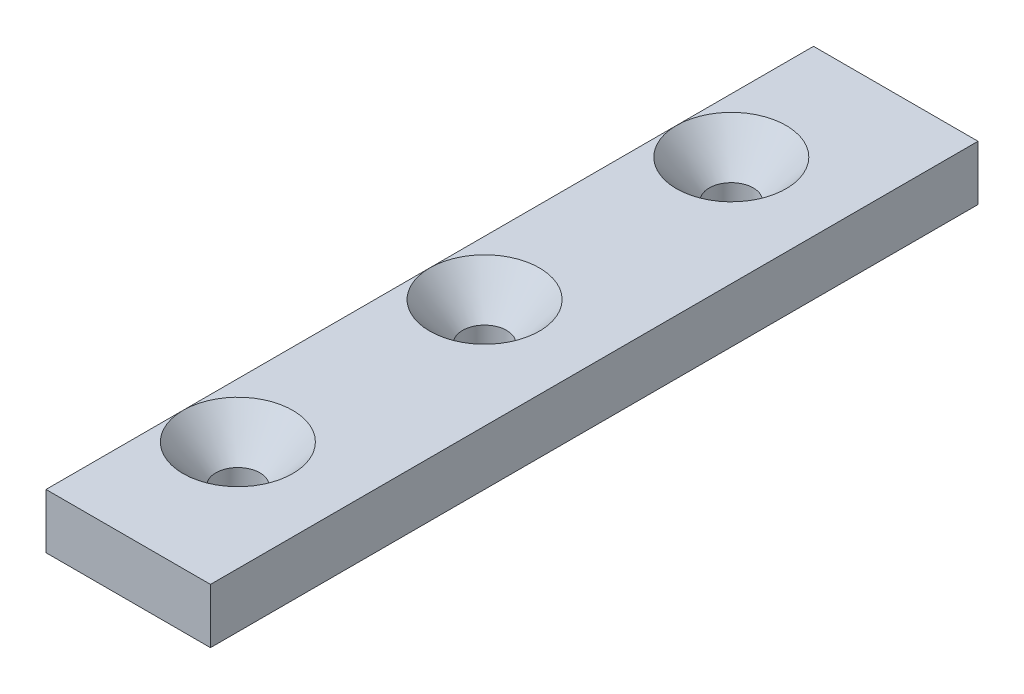
ISO-10303-21;
HEADER;
FILE_DESCRIPTION(('STEP AP214'),'2;1');
FILE_NAME('part.step','',(''),(''),'','','');
FILE_SCHEMA(('AUTOMOTIVE_DESIGN { 1 0 10303 214 1 1 1 1 }'));
ENDSEC;
DATA;
#1=APPLICATION_CONTEXT('core data for automotive mechanical design processes');
#2=APPLICATION_PROTOCOL_DEFINITION('international standard','automotive_design',2000,#1);
#3=PRODUCT_CONTEXT('',#1,'mechanical');
#4=PRODUCT('Part','Part','',(#3));
#5=PRODUCT_RELATED_PRODUCT_CATEGORY('part','',(#4));
#6=PRODUCT_DEFINITION_FORMATION('','',#4);
#7=PRODUCT_DEFINITION_CONTEXT('part definition',#1,'design');
#8=PRODUCT_DEFINITION('design','',#6,#7);
#9=PRODUCT_DEFINITION_SHAPE('','',#8);
#10=(LENGTH_UNIT() NAMED_UNIT(*) SI_UNIT(.MILLI.,.METRE.));
#11=(NAMED_UNIT(*) PLANE_ANGLE_UNIT() SI_UNIT($,.RADIAN.));
#12=(NAMED_UNIT(*) SI_UNIT($,.STERADIAN.) SOLID_ANGLE_UNIT());
#13=UNCERTAINTY_MEASURE_WITH_UNIT(LENGTH_MEASURE(1.E-05),#10,'distance_accuracy_value','');
#14=(GEOMETRIC_REPRESENTATION_CONTEXT(3) GLOBAL_UNCERTAINTY_ASSIGNED_CONTEXT((#13)) GLOBAL_UNIT_ASSIGNED_CONTEXT((#10,
#11,#12)) REPRESENTATION_CONTEXT('',''));
#15=CARTESIAN_POINT('',(0.,0.,0.));
#16=DIRECTION('',(0.,0.,1.));
#17=DIRECTION('',(1.,0.,0.));
#18=AXIS2_PLACEMENT_3D('',#15,#16,#17);
#19=CARTESIAN_POINT('',(0.,6.35,0.));
#20=DIRECTION('',(-1.,0.,0.));
#21=DIRECTION('',(0.,0.,1.));
#22=AXIS2_PLACEMENT_3D('',#19,#20,#21);
#23=PLANE('',#22);
#24=DIRECTION('',(0.,0.,-1.));
#25=VECTOR('',#24,1.);
#26=CARTESIAN_POINT('',(0.,0.,0.));
#27=LINE('',#26,#25);
#28=CARTESIAN_POINT('',(0.,0.,0.));
#29=VERTEX_POINT('',#28);
#30=CARTESIAN_POINT('',(0.,0.,-88.9));
#31=VERTEX_POINT('',#30);
#32=EDGE_CURVE('E106',#29,#31,#27,.T.);
#33=ORIENTED_EDGE('',*,*,#32,.T.);
#34=DIRECTION('',(0.,-1.,0.));
#35=VECTOR('',#34,1.);
#36=CARTESIAN_POINT('',(0.,6.35,-88.9));
#37=LINE('',#36,#35);
#38=CARTESIAN_POINT('',(0.,6.35,-88.9));
#39=VERTEX_POINT('',#38);
#40=EDGE_CURVE('E11',#39,#31,#37,.T.);
#41=ORIENTED_EDGE('',*,*,#40,.F.);
#42=DIRECTION('',(0.,0.,-1.));
#43=VECTOR('',#42,1.);
#44=CARTESIAN_POINT('',(0.,6.35,0.));
#45=LINE('',#44,#43);
#46=CARTESIAN_POINT('',(0.,6.35,0.));
#47=VERTEX_POINT('',#46);
#48=EDGE_CURVE('E93',#47,#39,#45,.T.);
#49=ORIENTED_EDGE('',*,*,#48,.F.);
#50=DIRECTION('',(0.,-1.,0.));
#51=VECTOR('',#50,1.);
#52=CARTESIAN_POINT('',(0.,6.35,0.));
#53=LINE('',#52,#51);
#54=EDGE_CURVE('E107',#47,#29,#53,.T.);
#55=ORIENTED_EDGE('',*,*,#54,.T.);
#56=EDGE_LOOP('',(#33,#41,#49,#55));
#57=FACE_BOUND('',#56,.T.);
#58=ADVANCED_FACE('F37',(#57),#23,.F.);
#59=CARTESIAN_POINT('',(0.,6.35,-88.9));
#60=DIRECTION('',(0.,0.,1.));
#61=DIRECTION('',(1.,0.,0.));
#62=AXIS2_PLACEMENT_3D('',#59,#60,#61);
#63=PLANE('',#62);
#64=DIRECTION('',(-1.,0.,0.));
#65=VECTOR('',#64,1.);
#66=CARTESIAN_POINT('',(0.,0.,-88.9));
#67=LINE('',#66,#65);
#68=CARTESIAN_POINT('',(-19.05,0.,-88.9));
#69=VERTEX_POINT('',#68);
#70=EDGE_CURVE('E110',#31,#69,#67,.T.);
#71=ORIENTED_EDGE('',*,*,#70,.T.);
#72=DIRECTION('',(0.,-1.,0.));
#73=VECTOR('',#72,1.);
#74=CARTESIAN_POINT('',(-19.05,6.35,-88.9));
#75=LINE('',#74,#73);
#76=CARTESIAN_POINT('',(-19.05,6.35,-88.9));
#77=VERTEX_POINT('',#76);
#78=EDGE_CURVE('E44',#77,#69,#75,.T.);
#79=ORIENTED_EDGE('',*,*,#78,.F.);
#80=DIRECTION('',(-1.,0.,0.));
#81=VECTOR('',#80,1.);
#82=CARTESIAN_POINT('',(0.,6.35,-88.9));
#83=LINE('',#82,#81);
#84=EDGE_CURVE('E83',#39,#77,#83,.T.);
#85=ORIENTED_EDGE('',*,*,#84,.F.);
#86=ORIENTED_EDGE('',*,*,#40,.T.);
#87=EDGE_LOOP('',(#71,#79,#85,#86));
#88=FACE_BOUND('',#87,.T.);
#89=ADVANCED_FACE('F85',(#88),#63,.F.);
#90=CARTESIAN_POINT('',(-19.05,6.35,0.));
#91=DIRECTION('',(1.,0.,0.));
#92=DIRECTION('',(0.,0.,-1.));
#93=AXIS2_PLACEMENT_3D('',#90,#91,#92);
#94=PLANE('',#93);
#95=DIRECTION('',(0.,0.,1.));
#96=VECTOR('',#95,1.);
#97=CARTESIAN_POINT('',(-19.05,0.,0.));
#98=LINE('',#97,#96);
#99=CARTESIAN_POINT('',(-19.05,0.,0.));
#100=VERTEX_POINT('',#99);
#101=EDGE_CURVE('E113',#69,#100,#98,.T.);
#102=ORIENTED_EDGE('',*,*,#101,.T.);
#103=DIRECTION('',(0.,-1.,0.));
#104=VECTOR('',#103,1.);
#105=CARTESIAN_POINT('',(-19.05,6.35,0.));
#106=LINE('',#105,#104);
#107=CARTESIAN_POINT('',(-19.05,6.35,0.));
#108=VERTEX_POINT('',#107);
#109=EDGE_CURVE('E124',#108,#100,#106,.T.);
#110=ORIENTED_EDGE('',*,*,#109,.F.);
#111=DIRECTION('',(0.,0.,1.));
#112=VECTOR('',#111,1.);
#113=CARTESIAN_POINT('',(-19.05,6.35,0.));
#114=LINE('',#113,#112);
#115=CARTESIAN_POINT('',(-19.05,6.35,-15.875));
#116=VERTEX_POINT('',#115);
#117=EDGE_CURVE('E92',#116,#108,#114,.T.);
#118=ORIENTED_EDGE('',*,*,#117,.F.);
#119=CARTESIAN_POINT('',(-19.05,6.35,-44.45));
#120=VERTEX_POINT('',#119);
#121=EDGE_CURVE('E137',#120,#116,#114,.T.);
#122=ORIENTED_EDGE('',*,*,#121,.F.);
#123=CARTESIAN_POINT('',(-19.05,6.35,-73.025));
#124=VERTEX_POINT('',#123);
#125=EDGE_CURVE('E139',#124,#120,#114,.T.);
#126=ORIENTED_EDGE('',*,*,#125,.F.);
#127=EDGE_CURVE('E131',#77,#124,#114,.T.);
#128=ORIENTED_EDGE('',*,*,#127,.F.);
#129=ORIENTED_EDGE('',*,*,#78,.T.);
#130=EDGE_LOOP('',(#102,#110,#118,#122,#126,#128,#129));
#131=FACE_BOUND('',#130,.T.);
#132=ADVANCED_FACE('F128',(#131),#94,.F.);
#133=CARTESIAN_POINT('',(0.,6.35,0.));
#134=DIRECTION('',(0.,0.,-1.));
#135=DIRECTION('',(-1.,0.,0.));
#136=AXIS2_PLACEMENT_3D('',#133,#134,#135);
#137=PLANE('',#136);
#138=DIRECTION('',(1.,0.,0.));
#139=VECTOR('',#138,1.);
#140=CARTESIAN_POINT('',(0.,0.,0.));
#141=LINE('',#140,#139);
#142=EDGE_CURVE('E103',#100,#29,#141,.T.);
#143=ORIENTED_EDGE('',*,*,#142,.T.);
#144=ORIENTED_EDGE('',*,*,#54,.F.);
#145=DIRECTION('',(1.,0.,0.));
#146=VECTOR('',#145,1.);
#147=CARTESIAN_POINT('',(0.,6.35,0.));
#148=LINE('',#147,#146);
#149=EDGE_CURVE('E99',#108,#47,#148,.T.);
#150=ORIENTED_EDGE('',*,*,#149,.F.);
#151=ORIENTED_EDGE('',*,*,#109,.T.);
#152=EDGE_LOOP('',(#143,#144,#150,#151));
#153=FACE_BOUND('',#152,.T.);
#154=ADVANCED_FACE('F134',(#153),#137,.F.);
#155=CARTESIAN_POINT('',(0.,6.35,0.));
#156=DIRECTION('',(0.,1.,0.));
#157=DIRECTION('',(0.,0.,1.));
#158=AXIS2_PLACEMENT_3D('',#155,#156,#157);
#159=PLANE('',#158);
#160=ORIENTED_EDGE('',*,*,#121,.T.);
#161=CARTESIAN_POINT('',(-12.7,6.35,-15.875));
#162=DIRECTION('',(0.,1.,0.));
#163=DIRECTION('',(0.,0.,1.));
#164=AXIS2_PLACEMENT_3D('',#161,#162,#163);
#165=CIRCLE('',#164,6.35);
#166=EDGE_CURVE('E49',#116,#116,#165,.T.);
#167=ORIENTED_EDGE('',*,*,#166,.F.);
#168=ORIENTED_EDGE('',*,*,#117,.T.);
#169=ORIENTED_EDGE('',*,*,#149,.T.);
#170=ORIENTED_EDGE('',*,*,#48,.T.);
#171=ORIENTED_EDGE('',*,*,#84,.T.);
#172=ORIENTED_EDGE('',*,*,#127,.T.);
#173=CARTESIAN_POINT('',(-12.7,6.35,-73.025));
#174=DIRECTION('',(0.,1.,0.));
#175=DIRECTION('',(0.,0.,1.));
#176=AXIS2_PLACEMENT_3D('',#173,#174,#175);
#177=CIRCLE('',#176,6.35);
#178=EDGE_CURVE('E143',#124,#124,#177,.T.);
#179=ORIENTED_EDGE('',*,*,#178,.F.);
#180=ORIENTED_EDGE('',*,*,#125,.T.);
#181=CARTESIAN_POINT('',(-12.7,6.35,-44.45));
#182=DIRECTION('',(0.,1.,0.));
#183=DIRECTION('',(0.,0.,1.));
#184=AXIS2_PLACEMENT_3D('',#181,#182,#183);
#185=CIRCLE('',#184,6.35);
#186=EDGE_CURVE('E54',#120,#120,#185,.T.);
#187=ORIENTED_EDGE('',*,*,#186,.F.);
#188=EDGE_LOOP('',(#160,#167,#168,#169,#170,#171,#172,#179,#180,#187));
#189=FACE_BOUND('',#188,.T.);
#190=ADVANCED_FACE('F97',(#189),#159,.T.);
#191=CARTESIAN_POINT('',(0.,0.,0.));
#192=DIRECTION('',(0.,1.,0.));
#193=DIRECTION('',(0.,0.,1.));
#194=AXIS2_PLACEMENT_3D('',#191,#192,#193);
#195=PLANE('',#194);
#196=CARTESIAN_POINT('',(-12.7,0.,-15.875));
#197=DIRECTION('',(0.,1.,0.));
#198=DIRECTION('',(0.,0.,1.));
#199=AXIS2_PLACEMENT_3D('',#196,#197,#198);
#200=CIRCLE('',#199,2.5527);
#201=CARTESIAN_POINT('',(-12.7,0.,-13.3223));
#202=VERTEX_POINT('',#201);
#203=EDGE_CURVE('E152',#202,#202,#200,.T.);
#204=ORIENTED_EDGE('',*,*,#203,.T.);
#205=EDGE_LOOP('',(#204));
#206=FACE_BOUND('',#205,.T.);
#207=CARTESIAN_POINT('',(-12.7,0.,-44.45));
#208=DIRECTION('',(0.,1.,0.));
#209=DIRECTION('',(0.,0.,1.));
#210=AXIS2_PLACEMENT_3D('',#207,#208,#209);
#211=CIRCLE('',#210,2.5527);
#212=CARTESIAN_POINT('',(-12.7,0.,-41.8973));
#213=VERTEX_POINT('',#212);
#214=EDGE_CURVE('E145',#213,#213,#211,.T.);
#215=ORIENTED_EDGE('',*,*,#214,.T.);
#216=EDGE_LOOP('',(#215));
#217=FACE_BOUND('',#216,.T.);
#218=CARTESIAN_POINT('',(-12.7,0.,-73.025));
#219=DIRECTION('',(0.,1.,0.));
#220=DIRECTION('',(0.,0.,1.));
#221=AXIS2_PLACEMENT_3D('',#218,#219,#220);
#222=CIRCLE('',#221,2.5527);
#223=CARTESIAN_POINT('',(-12.7,0.,-70.4723));
#224=VERTEX_POINT('',#223);
#225=EDGE_CURVE('E111',#224,#224,#222,.T.);
#226=ORIENTED_EDGE('',*,*,#225,.T.);
#227=EDGE_LOOP('',(#226));
#228=FACE_BOUND('',#227,.T.);
#229=ORIENTED_EDGE('',*,*,#32,.F.);
#230=ORIENTED_EDGE('',*,*,#142,.F.);
#231=ORIENTED_EDGE('',*,*,#101,.F.);
#232=ORIENTED_EDGE('',*,*,#70,.F.);
#233=EDGE_LOOP('',(#229,#230,#231,#232));
#234=FACE_BOUND('',#233,.T.);
#235=ADVANCED_FACE('F132',(#206,#217,#228,#234),#195,.F.);
#236=CARTESIAN_POINT('',(-12.7,6.35,-73.025));
#237=DIRECTION('',(0.,1.,0.));
#238=DIRECTION('',(0.,0.,1.));
#239=AXIS2_PLACEMENT_3D('',#236,#237,#238);
#240=CYLINDRICAL_SURFACE('',#239,2.5527);
#241=ORIENTED_EDGE('',*,*,#225,.F.);
#242=EDGE_LOOP('',(#241));
#243=FACE_BOUND('',#242,.T.);
#244=CARTESIAN_POINT('',(-12.7,1.98170604725966,-73.025));
#245=DIRECTION('',(0.,1.,0.));
#246=DIRECTION('',(0.,0.,1.));
#247=AXIS2_PLACEMENT_3D('',#244,#245,#246);
#248=CIRCLE('',#247,2.5527);
#249=CARTESIAN_POINT('',(-12.7,1.98170604725966,-70.4723));
#250=VERTEX_POINT('',#249);
#251=EDGE_CURVE('E116',#250,#250,#248,.T.);
#252=ORIENTED_EDGE('',*,*,#251,.T.);
#253=EDGE_LOOP('',(#252));
#254=FACE_BOUND('',#253,.T.);
#255=ADVANCED_FACE('F184',(#243,#254),#240,.F.);
#256=CARTESIAN_POINT('',(-12.7,6.35,-73.025));
#257=DIRECTION('',(0.,1.,0.));
#258=DIRECTION('',(0.,0.,1.));
#259=AXIS2_PLACEMENT_3D('',#256,#257,#258);
#260=CONICAL_SURFACE('',#259,6.35,0.715584993317675);
#261=ORIENTED_EDGE('',*,*,#251,.F.);
#262=EDGE_LOOP('',(#261));
#263=FACE_BOUND('',#262,.T.);
#264=ORIENTED_EDGE('',*,*,#178,.T.);
#265=EDGE_LOOP('',(#264));
#266=FACE_BOUND('',#265,.T.);
#267=ADVANCED_FACE('F190',(#263,#266),#260,.F.);
#268=CARTESIAN_POINT('',(-12.7,6.35,-44.45));
#269=DIRECTION('',(0.,1.,0.));
#270=DIRECTION('',(0.,0.,1.));
#271=AXIS2_PLACEMENT_3D('',#268,#269,#270);
#272=CYLINDRICAL_SURFACE('',#271,2.5527);
#273=ORIENTED_EDGE('',*,*,#214,.F.);
#274=EDGE_LOOP('',(#273));
#275=FACE_BOUND('',#274,.T.);
#276=CARTESIAN_POINT('',(-12.7,1.98170604725966,-44.45));
#277=DIRECTION('',(0.,1.,0.));
#278=DIRECTION('',(0.,0.,1.));
#279=AXIS2_PLACEMENT_3D('',#276,#277,#278);
#280=CIRCLE('',#279,2.5527);
#281=CARTESIAN_POINT('',(-12.7,1.98170604725966,-41.8973));
#282=VERTEX_POINT('',#281);
#283=EDGE_CURVE('E148',#282,#282,#280,.T.);
#284=ORIENTED_EDGE('',*,*,#283,.T.);
#285=EDGE_LOOP('',(#284));
#286=FACE_BOUND('',#285,.T.);
#287=ADVANCED_FACE('F194',(#275,#286),#272,.F.);
#288=CARTESIAN_POINT('',(-12.7,6.35,-44.45));
#289=DIRECTION('',(0.,1.,0.));
#290=DIRECTION('',(0.,0.,1.));
#291=AXIS2_PLACEMENT_3D('',#288,#289,#290);
#292=CONICAL_SURFACE('',#291,6.35,0.715584993317675);
#293=ORIENTED_EDGE('',*,*,#283,.F.);
#294=EDGE_LOOP('',(#293));
#295=FACE_BOUND('',#294,.T.);
#296=ORIENTED_EDGE('',*,*,#186,.T.);
#297=EDGE_LOOP('',(#296));
#298=FACE_BOUND('',#297,.T.);
#299=ADVANCED_FACE('F168',(#295,#298),#292,.F.);
#300=CARTESIAN_POINT('',(-12.7,6.35,-15.875));
#301=DIRECTION('',(0.,1.,0.));
#302=DIRECTION('',(0.,0.,1.));
#303=AXIS2_PLACEMENT_3D('',#300,#301,#302);
#304=CYLINDRICAL_SURFACE('',#303,2.5527);
#305=ORIENTED_EDGE('',*,*,#203,.F.);
#306=EDGE_LOOP('',(#305));
#307=FACE_BOUND('',#306,.T.);
#308=CARTESIAN_POINT('',(-12.7,1.98170604725966,-15.875));
#309=DIRECTION('',(0.,1.,0.));
#310=DIRECTION('',(0.,0.,1.));
#311=AXIS2_PLACEMENT_3D('',#308,#309,#310);
#312=CIRCLE('',#311,2.5527);
#313=CARTESIAN_POINT('',(-12.7,1.98170604725966,-13.3223));
#314=VERTEX_POINT('',#313);
#315=EDGE_CURVE('E155',#314,#314,#312,.T.);
#316=ORIENTED_EDGE('',*,*,#315,.T.);
#317=EDGE_LOOP('',(#316));
#318=FACE_BOUND('',#317,.T.);
#319=ADVANCED_FACE('F160',(#307,#318),#304,.F.);
#320=CARTESIAN_POINT('',(-12.7,6.35,-15.875));
#321=DIRECTION('',(0.,1.,0.));
#322=DIRECTION('',(0.,0.,1.));
#323=AXIS2_PLACEMENT_3D('',#320,#321,#322);
#324=CONICAL_SURFACE('',#323,6.35,0.715584993317675);
#325=ORIENTED_EDGE('',*,*,#315,.F.);
#326=EDGE_LOOP('',(#325));
#327=FACE_BOUND('',#326,.T.);
#328=ORIENTED_EDGE('',*,*,#166,.T.);
#329=EDGE_LOOP('',(#328));
#330=FACE_BOUND('',#329,.T.);
#331=ADVANCED_FACE('F162',(#327,#330),#324,.F.);
#332=CLOSED_SHELL('',(#58,#89,#132,#154,#190,#235,#255,#267,#287,#299,#319,#331));
#333=MANIFOLD_SOLID_BREP('B2',#332);
#334=ADVANCED_BREP_SHAPE_REPRESENTATION('',(#18,#333),#14);
#335=SHAPE_DEFINITION_REPRESENTATION(#9,#334);
ENDSEC;
END-ISO-10303-21;
